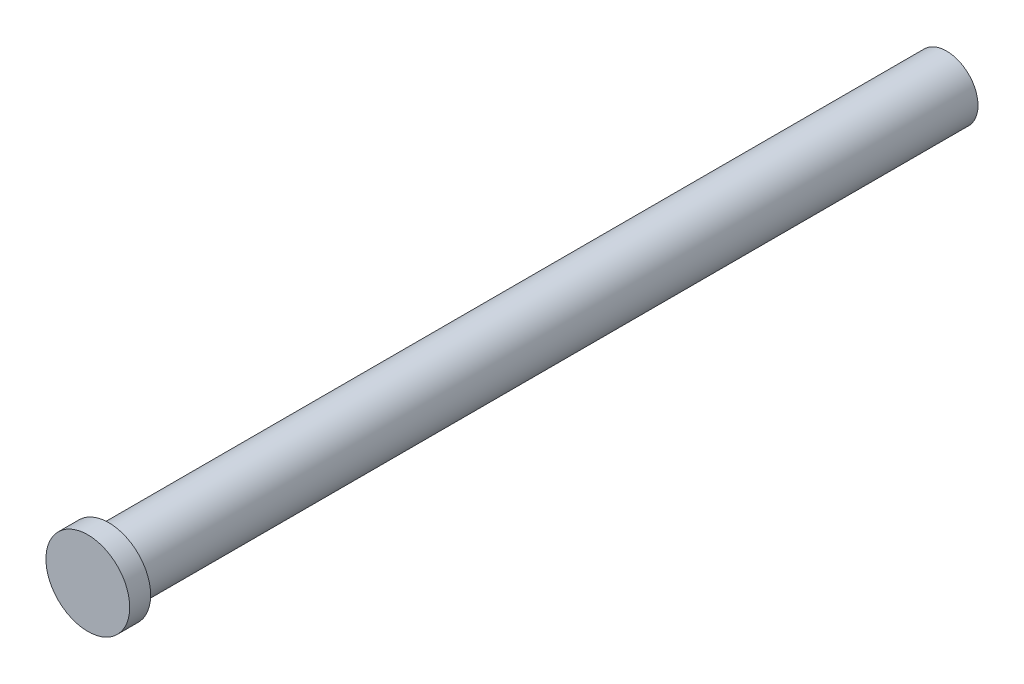
ISO-10303-21;
HEADER;
FILE_DESCRIPTION(('STEP AP214'),'2;1');
FILE_NAME('part.step','',(''),(''),'','','');
FILE_SCHEMA(('AUTOMOTIVE_DESIGN { 1 0 10303 214 1 1 1 1 }'));
ENDSEC;
DATA;
#1=APPLICATION_CONTEXT('core data for automotive mechanical design processes');
#2=APPLICATION_PROTOCOL_DEFINITION('international standard','automotive_design',2000,#1);
#3=PRODUCT_CONTEXT('',#1,'mechanical');
#4=PRODUCT('Part','Part','',(#3));
#5=PRODUCT_RELATED_PRODUCT_CATEGORY('part','',(#4));
#6=PRODUCT_DEFINITION_FORMATION('','',#4);
#7=PRODUCT_DEFINITION_CONTEXT('part definition',#1,'design');
#8=PRODUCT_DEFINITION('design','',#6,#7);
#9=PRODUCT_DEFINITION_SHAPE('','',#8);
#10=(LENGTH_UNIT() NAMED_UNIT(*) SI_UNIT(.MILLI.,.METRE.));
#11=(NAMED_UNIT(*) PLANE_ANGLE_UNIT() SI_UNIT($,.RADIAN.));
#12=(NAMED_UNIT(*) SI_UNIT($,.STERADIAN.) SOLID_ANGLE_UNIT());
#13=UNCERTAINTY_MEASURE_WITH_UNIT(LENGTH_MEASURE(1.E-05),#10,'distance_accuracy_value','');
#14=(GEOMETRIC_REPRESENTATION_CONTEXT(3) GLOBAL_UNCERTAINTY_ASSIGNED_CONTEXT((#13)) GLOBAL_UNIT_ASSIGNED_CONTEXT((#10,
#11,#12)) REPRESENTATION_CONTEXT('',''));
#15=CARTESIAN_POINT('',(0.,0.,0.));
#16=DIRECTION('',(0.,0.,1.));
#17=DIRECTION('',(1.,0.,0.));
#18=AXIS2_PLACEMENT_3D('',#15,#16,#17);
#19=CARTESIAN_POINT('',(0.,0.,80.));
#20=DIRECTION('',(0.,0.,-1.));
#21=DIRECTION('',(-1.,0.,0.));
#22=AXIS2_PLACEMENT_3D('',#19,#20,#21);
#23=CYLINDRICAL_SURFACE('',#22,3.);
#24=CARTESIAN_POINT('',(0.,0.,80.));
#25=DIRECTION('',(0.,0.,1.));
#26=DIRECTION('',(1.,0.,0.));
#27=AXIS2_PLACEMENT_3D('',#24,#25,#26);
#28=CIRCLE('',#27,3.);
#29=CARTESIAN_POINT('',(3.,0.,80.));
#30=VERTEX_POINT('',#29);
#31=EDGE_CURVE('E10',#30,#30,#28,.T.);
#32=ORIENTED_EDGE('',*,*,#31,.F.);
#33=EDGE_LOOP('',(#32));
#34=FACE_BOUND('',#33,.T.);
#35=CARTESIAN_POINT('',(0.,0.,0.));
#36=DIRECTION('',(0.,0.,1.));
#37=DIRECTION('',(1.,0.,0.));
#38=AXIS2_PLACEMENT_3D('',#35,#36,#37);
#39=CIRCLE('',#38,3.);
#40=CARTESIAN_POINT('',(3.,0.,0.));
#41=VERTEX_POINT('',#40);
#42=EDGE_CURVE('E40',#41,#41,#39,.T.);
#43=ORIENTED_EDGE('',*,*,#42,.T.);
#44=EDGE_LOOP('',(#43));
#45=FACE_BOUND('',#44,.T.);
#46=ADVANCED_FACE('F37',(#34,#45),#23,.T.);
#47=CARTESIAN_POINT('',(0.,0.,0.));
#48=DIRECTION('',(0.,0.,1.));
#49=DIRECTION('',(1.,0.,0.));
#50=AXIS2_PLACEMENT_3D('',#47,#48,#49);
#51=PLANE('',#50);
#52=ORIENTED_EDGE('',*,*,#42,.F.);
#53=EDGE_LOOP('',(#52));
#54=FACE_BOUND('',#53,.T.);
#55=ADVANCED_FACE('F60',(#54),#51,.F.);
#56=CARTESIAN_POINT('',(0.,0.,82.));
#57=DIRECTION('',(0.,0.,-1.));
#58=DIRECTION('',(-1.,0.,0.));
#59=AXIS2_PLACEMENT_3D('',#56,#57,#58);
#60=CYLINDRICAL_SURFACE('',#59,4.);
#61=CARTESIAN_POINT('',(0.,0.,82.));
#62=DIRECTION('',(0.,0.,1.));
#63=DIRECTION('',(1.,0.,0.));
#64=AXIS2_PLACEMENT_3D('',#61,#62,#63);
#65=CIRCLE('',#64,4.);
#66=CARTESIAN_POINT('',(4.,0.,82.));
#67=VERTEX_POINT('',#66);
#68=EDGE_CURVE('E47',#67,#67,#65,.T.);
#69=ORIENTED_EDGE('',*,*,#68,.F.);
#70=EDGE_LOOP('',(#69));
#71=FACE_BOUND('',#70,.T.);
#72=CARTESIAN_POINT('',(0.,0.,80.));
#73=DIRECTION('',(0.,0.,1.));
#74=DIRECTION('',(1.,0.,0.));
#75=AXIS2_PLACEMENT_3D('',#72,#73,#74);
#76=CIRCLE('',#75,4.);
#77=CARTESIAN_POINT('',(4.,0.,80.));
#78=VERTEX_POINT('',#77);
#79=EDGE_CURVE('E49',#78,#78,#76,.T.);
#80=ORIENTED_EDGE('',*,*,#79,.T.);
#81=EDGE_LOOP('',(#80));
#82=FACE_BOUND('',#81,.T.);
#83=ADVANCED_FACE('F57',(#71,#82),#60,.T.);
#84=CARTESIAN_POINT('',(0.,0.,82.));
#85=DIRECTION('',(0.,0.,1.));
#86=DIRECTION('',(1.,0.,0.));
#87=AXIS2_PLACEMENT_3D('',#84,#85,#86);
#88=PLANE('',#87);
#89=ORIENTED_EDGE('',*,*,#68,.T.);
#90=EDGE_LOOP('',(#89));
#91=FACE_BOUND('',#90,.T.);
#92=ADVANCED_FACE('F55',(#91),#88,.T.);
#93=CARTESIAN_POINT('',(0.,0.,80.));
#94=DIRECTION('',(0.,0.,1.));
#95=DIRECTION('',(1.,0.,0.));
#96=AXIS2_PLACEMENT_3D('',#93,#94,#95);
#97=PLANE('',#96);
#98=ORIENTED_EDGE('',*,*,#31,.T.);
#99=EDGE_LOOP('',(#98));
#100=FACE_BOUND('',#99,.T.);
#101=ORIENTED_EDGE('',*,*,#79,.F.);
#102=EDGE_LOOP('',(#101));
#103=FACE_BOUND('',#102,.T.);
#104=ADVANCED_FACE('F64',(#100,#103),#97,.F.);
#105=CLOSED_SHELL('',(#46,#55,#83,#92,#104));
#106=MANIFOLD_SOLID_BREP('B2',#105);
#107=ADVANCED_BREP_SHAPE_REPRESENTATION('',(#18,#106),#14);
#108=SHAPE_DEFINITION_REPRESENTATION(#9,#107);
ENDSEC;
END-ISO-10303-21;
